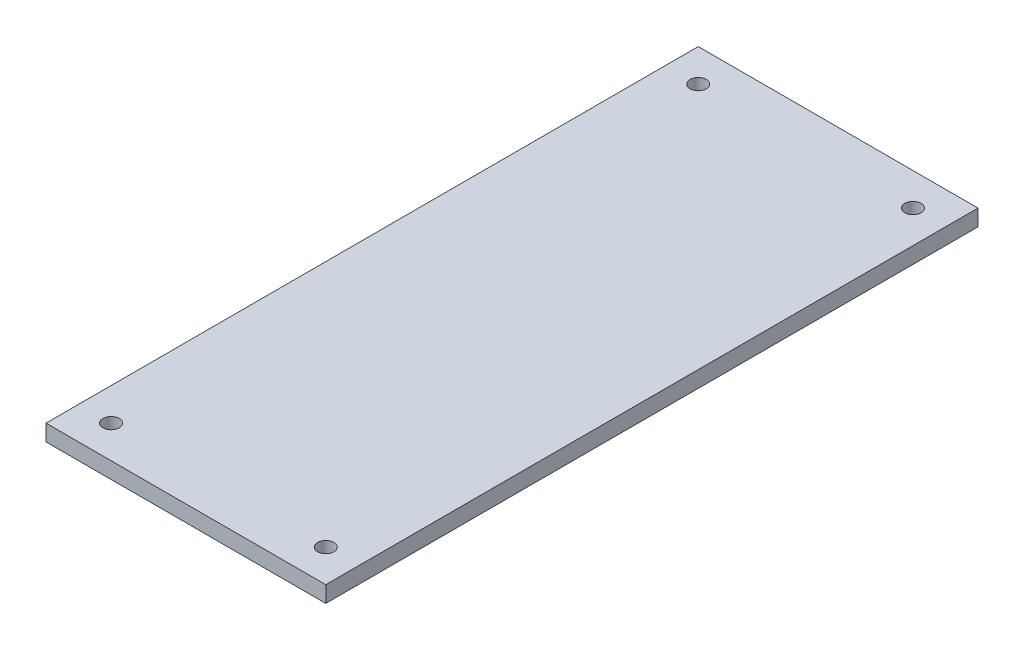
ISO-10303-21;
HEADER;
FILE_DESCRIPTION(('STEP AP214'),'2;1');
FILE_NAME('part.step','',(''),(''),'','','');
FILE_SCHEMA(('AUTOMOTIVE_DESIGN { 1 0 10303 214 1 1 1 1 }'));
ENDSEC;
DATA;
#1=APPLICATION_CONTEXT('core data for automotive mechanical design processes');
#2=APPLICATION_PROTOCOL_DEFINITION('international standard','automotive_design',2000,#1);
#3=PRODUCT_CONTEXT('',#1,'mechanical');
#4=PRODUCT('Part','Part','',(#3));
#5=PRODUCT_RELATED_PRODUCT_CATEGORY('part','',(#4));
#6=PRODUCT_DEFINITION_FORMATION('','',#4);
#7=PRODUCT_DEFINITION_CONTEXT('part definition',#1,'design');
#8=PRODUCT_DEFINITION('design','',#6,#7);
#9=PRODUCT_DEFINITION_SHAPE('','',#8);
#10=(LENGTH_UNIT() NAMED_UNIT(*) SI_UNIT(.MILLI.,.METRE.));
#11=(NAMED_UNIT(*) PLANE_ANGLE_UNIT() SI_UNIT($,.RADIAN.));
#12=(NAMED_UNIT(*) SI_UNIT($,.STERADIAN.) SOLID_ANGLE_UNIT());
#13=UNCERTAINTY_MEASURE_WITH_UNIT(LENGTH_MEASURE(1.E-05),#10,'distance_accuracy_value','');
#14=(GEOMETRIC_REPRESENTATION_CONTEXT(3) GLOBAL_UNCERTAINTY_ASSIGNED_CONTEXT((#13)) GLOBAL_UNIT_ASSIGNED_CONTEXT((#10,
#11,#12)) REPRESENTATION_CONTEXT('',''));
#15=CARTESIAN_POINT('',(0.,0.,0.));
#16=DIRECTION('',(0.,0.,1.));
#17=DIRECTION('',(1.,0.,0.));
#18=AXIS2_PLACEMENT_3D('',#15,#16,#17);
#19=CARTESIAN_POINT('',(43.,5.,-100.25));
#20=DIRECTION('',(-1.,0.,0.));
#21=DIRECTION('',(0.,0.,1.));
#22=AXIS2_PLACEMENT_3D('',#19,#20,#21);
#23=PLANE('',#22);
#24=DIRECTION('',(0.,0.,-1.));
#25=VECTOR('',#24,1.);
#26=CARTESIAN_POINT('',(43.,0.,-100.25));
#27=LINE('',#26,#25);
#28=CARTESIAN_POINT('',(43.,0.,100.25));
#29=VERTEX_POINT('',#28);
#30=CARTESIAN_POINT('',(43.,0.,-100.25));
#31=VERTEX_POINT('',#30);
#32=EDGE_CURVE('E96',#29,#31,#27,.T.);
#33=ORIENTED_EDGE('',*,*,#32,.T.);
#34=DIRECTION('',(0.,-1.,0.));
#35=VECTOR('',#34,1.);
#36=CARTESIAN_POINT('',(43.,5.,-100.25));
#37=LINE('',#36,#35);
#38=CARTESIAN_POINT('',(43.,5.,-100.25));
#39=VERTEX_POINT('',#38);
#40=EDGE_CURVE('E11',#39,#31,#37,.T.);
#41=ORIENTED_EDGE('',*,*,#40,.F.);
#42=DIRECTION('',(0.,0.,-1.));
#43=VECTOR('',#42,1.);
#44=CARTESIAN_POINT('',(43.,5.,-100.25));
#45=LINE('',#44,#43);
#46=CARTESIAN_POINT('',(43.,5.,100.25));
#47=VERTEX_POINT('',#46);
#48=EDGE_CURVE('E84',#47,#39,#45,.T.);
#49=ORIENTED_EDGE('',*,*,#48,.F.);
#50=DIRECTION('',(0.,-1.,0.));
#51=VECTOR('',#50,1.);
#52=CARTESIAN_POINT('',(43.,5.,100.25));
#53=LINE('',#52,#51);
#54=EDGE_CURVE('E92',#47,#29,#53,.T.);
#55=ORIENTED_EDGE('',*,*,#54,.T.);
#56=EDGE_LOOP('',(#33,#41,#49,#55));
#57=FACE_BOUND('',#56,.T.);
#58=ADVANCED_FACE('F33',(#57),#23,.F.);
#59=CARTESIAN_POINT('',(-43.,5.,-100.25));
#60=DIRECTION('',(0.,0.,1.));
#61=DIRECTION('',(1.,0.,0.));
#62=AXIS2_PLACEMENT_3D('',#59,#60,#61);
#63=PLANE('',#62);
#64=DIRECTION('',(-1.,0.,0.));
#65=VECTOR('',#64,1.);
#66=CARTESIAN_POINT('',(-43.,0.,-100.25));
#67=LINE('',#66,#65);
#68=CARTESIAN_POINT('',(-43.,0.,-100.25));
#69=VERTEX_POINT('',#68);
#70=EDGE_CURVE('E88',#31,#69,#67,.T.);
#71=ORIENTED_EDGE('',*,*,#70,.T.);
#72=DIRECTION('',(0.,-1.,0.));
#73=VECTOR('',#72,1.);
#74=CARTESIAN_POINT('',(-43.,5.,-100.25));
#75=LINE('',#74,#73);
#76=CARTESIAN_POINT('',(-43.,5.,-100.25));
#77=VERTEX_POINT('',#76);
#78=EDGE_CURVE('E41',#77,#69,#75,.T.);
#79=ORIENTED_EDGE('',*,*,#78,.F.);
#80=DIRECTION('',(-1.,0.,0.));
#81=VECTOR('',#80,1.);
#82=CARTESIAN_POINT('',(-43.,5.,-100.25));
#83=LINE('',#82,#81);
#84=EDGE_CURVE('E79',#39,#77,#83,.T.);
#85=ORIENTED_EDGE('',*,*,#84,.F.);
#86=ORIENTED_EDGE('',*,*,#40,.T.);
#87=EDGE_LOOP('',(#71,#79,#85,#86));
#88=FACE_BOUND('',#87,.T.);
#89=ADVANCED_FACE('F87',(#88),#63,.F.);
#90=CARTESIAN_POINT('',(-43.,5.,-100.25));
#91=DIRECTION('',(1.,0.,0.));
#92=DIRECTION('',(0.,0.,-1.));
#93=AXIS2_PLACEMENT_3D('',#90,#91,#92);
#94=PLANE('',#93);
#95=DIRECTION('',(0.,0.,1.));
#96=VECTOR('',#95,1.);
#97=CARTESIAN_POINT('',(-43.,0.,-100.25));
#98=LINE('',#97,#96);
#99=CARTESIAN_POINT('',(-43.,0.,100.25));
#100=VERTEX_POINT('',#99);
#101=EDGE_CURVE('E66',#69,#100,#98,.T.);
#102=ORIENTED_EDGE('',*,*,#101,.T.);
#103=DIRECTION('',(0.,-1.,0.));
#104=VECTOR('',#103,1.);
#105=CARTESIAN_POINT('',(-43.,5.,100.25));
#106=LINE('',#105,#104);
#107=CARTESIAN_POINT('',(-43.,5.,100.25));
#108=VERTEX_POINT('',#107);
#109=EDGE_CURVE('E89',#108,#100,#106,.T.);
#110=ORIENTED_EDGE('',*,*,#109,.F.);
#111=DIRECTION('',(0.,0.,1.));
#112=VECTOR('',#111,1.);
#113=CARTESIAN_POINT('',(-43.,5.,-100.25));
#114=LINE('',#113,#112);
#115=EDGE_CURVE('E82',#77,#108,#114,.T.);
#116=ORIENTED_EDGE('',*,*,#115,.F.);
#117=ORIENTED_EDGE('',*,*,#78,.T.);
#118=EDGE_LOOP('',(#102,#110,#116,#117));
#119=FACE_BOUND('',#118,.T.);
#120=ADVANCED_FACE('F90',(#119),#94,.F.);
#121=CARTESIAN_POINT('',(-43.,5.,100.25));
#122=DIRECTION('',(0.,0.,-1.));
#123=DIRECTION('',(-1.,0.,0.));
#124=AXIS2_PLACEMENT_3D('',#121,#122,#123);
#125=PLANE('',#124);
#126=DIRECTION('',(1.,0.,0.));
#127=VECTOR('',#126,1.);
#128=CARTESIAN_POINT('',(-43.,0.,100.25));
#129=LINE('',#128,#127);
#130=EDGE_CURVE('E72',#100,#29,#129,.T.);
#131=ORIENTED_EDGE('',*,*,#130,.T.);
#132=ORIENTED_EDGE('',*,*,#54,.F.);
#133=DIRECTION('',(1.,0.,0.));
#134=VECTOR('',#133,1.);
#135=CARTESIAN_POINT('',(-43.,5.,100.25));
#136=LINE('',#135,#134);
#137=EDGE_CURVE('E49',#108,#47,#136,.T.);
#138=ORIENTED_EDGE('',*,*,#137,.F.);
#139=ORIENTED_EDGE('',*,*,#109,.T.);
#140=EDGE_LOOP('',(#131,#132,#138,#139));
#141=FACE_BOUND('',#140,.T.);
#142=ADVANCED_FACE('F104',(#141),#125,.F.);
#143=CARTESIAN_POINT('',(0.,5.,0.));
#144=DIRECTION('',(0.,1.,0.));
#145=DIRECTION('',(0.,0.,1.));
#146=AXIS2_PLACEMENT_3D('',#143,#144,#145);
#147=PLANE('',#146);
#148=CARTESIAN_POINT('',(33.,5.,-90.25));
#149=DIRECTION('',(0.,1.,0.));
#150=DIRECTION('',(0.,0.,1.));
#151=AXIS2_PLACEMENT_3D('',#148,#149,#150);
#152=CIRCLE('',#151,2.5);
#153=CARTESIAN_POINT('',(33.,5.,-87.75));
#154=VERTEX_POINT('',#153);
#155=EDGE_CURVE('E123',#154,#154,#152,.T.);
#156=ORIENTED_EDGE('',*,*,#155,.F.);
#157=EDGE_LOOP('',(#156));
#158=FACE_BOUND('',#157,.T.);
#159=CARTESIAN_POINT('',(-33.,5.,90.25));
#160=DIRECTION('',(0.,1.,0.));
#161=DIRECTION('',(0.,0.,1.));
#162=AXIS2_PLACEMENT_3D('',#159,#160,#161);
#163=CIRCLE('',#162,2.5);
#164=CARTESIAN_POINT('',(-33.,5.,92.75));
#165=VERTEX_POINT('',#164);
#166=EDGE_CURVE('E116',#165,#165,#163,.T.);
#167=ORIENTED_EDGE('',*,*,#166,.F.);
#168=EDGE_LOOP('',(#167));
#169=FACE_BOUND('',#168,.T.);
#170=CARTESIAN_POINT('',(33.,5.,90.25));
#171=DIRECTION('',(0.,1.,0.));
#172=DIRECTION('',(0.,0.,1.));
#173=AXIS2_PLACEMENT_3D('',#170,#171,#172);
#174=CIRCLE('',#173,2.5);
#175=CARTESIAN_POINT('',(33.,5.,92.75));
#176=VERTEX_POINT('',#175);
#177=EDGE_CURVE('E128',#176,#176,#174,.T.);
#178=ORIENTED_EDGE('',*,*,#177,.F.);
#179=EDGE_LOOP('',(#178));
#180=FACE_BOUND('',#179,.T.);
#181=CARTESIAN_POINT('',(-33.,5.,-90.25));
#182=DIRECTION('',(0.,1.,0.));
#183=DIRECTION('',(0.,0.,1.));
#184=AXIS2_PLACEMENT_3D('',#181,#182,#183);
#185=CIRCLE('',#184,2.5);
#186=CARTESIAN_POINT('',(-33.,5.,-87.75));
#187=VERTEX_POINT('',#186);
#188=EDGE_CURVE('E110',#187,#187,#185,.T.);
#189=ORIENTED_EDGE('',*,*,#188,.F.);
#190=EDGE_LOOP('',(#189));
#191=FACE_BOUND('',#190,.T.);
#192=ORIENTED_EDGE('',*,*,#48,.T.);
#193=ORIENTED_EDGE('',*,*,#84,.T.);
#194=ORIENTED_EDGE('',*,*,#115,.T.);
#195=ORIENTED_EDGE('',*,*,#137,.T.);
#196=EDGE_LOOP('',(#192,#193,#194,#195));
#197=FACE_BOUND('',#196,.T.);
#198=ADVANCED_FACE('F80',(#158,#169,#180,#191,#197),#147,.T.);
#199=CARTESIAN_POINT('',(0.,0.,0.));
#200=DIRECTION('',(0.,1.,0.));
#201=DIRECTION('',(0.,0.,1.));
#202=AXIS2_PLACEMENT_3D('',#199,#200,#201);
#203=PLANE('',#202);
#204=CARTESIAN_POINT('',(33.,0.,-90.25));
#205=DIRECTION('',(0.,1.,0.));
#206=DIRECTION('',(0.,0.,1.));
#207=AXIS2_PLACEMENT_3D('',#204,#205,#206);
#208=CIRCLE('',#207,2.5);
#209=CARTESIAN_POINT('',(33.,0.,-87.75));
#210=VERTEX_POINT('',#209);
#211=EDGE_CURVE('E113',#210,#210,#208,.T.);
#212=ORIENTED_EDGE('',*,*,#211,.T.);
#213=EDGE_LOOP('',(#212));
#214=FACE_BOUND('',#213,.T.);
#215=CARTESIAN_POINT('',(-33.,0.,90.25));
#216=DIRECTION('',(0.,1.,0.));
#217=DIRECTION('',(0.,0.,1.));
#218=AXIS2_PLACEMENT_3D('',#215,#216,#217);
#219=CIRCLE('',#218,2.5);
#220=CARTESIAN_POINT('',(-33.,0.,92.75));
#221=VERTEX_POINT('',#220);
#222=EDGE_CURVE('E119',#221,#221,#219,.T.);
#223=ORIENTED_EDGE('',*,*,#222,.T.);
#224=EDGE_LOOP('',(#223));
#225=FACE_BOUND('',#224,.T.);
#226=CARTESIAN_POINT('',(33.,0.,90.25));
#227=DIRECTION('',(0.,1.,0.));
#228=DIRECTION('',(0.,0.,1.));
#229=AXIS2_PLACEMENT_3D('',#226,#227,#228);
#230=CIRCLE('',#229,2.5);
#231=CARTESIAN_POINT('',(33.,0.,92.75));
#232=VERTEX_POINT('',#231);
#233=EDGE_CURVE('E120',#232,#232,#230,.T.);
#234=ORIENTED_EDGE('',*,*,#233,.T.);
#235=EDGE_LOOP('',(#234));
#236=FACE_BOUND('',#235,.T.);
#237=CARTESIAN_POINT('',(-33.,0.,-90.25));
#238=DIRECTION('',(0.,1.,0.));
#239=DIRECTION('',(0.,0.,1.));
#240=AXIS2_PLACEMENT_3D('',#237,#238,#239);
#241=CIRCLE('',#240,2.5);
#242=CARTESIAN_POINT('',(-33.,0.,-87.75));
#243=VERTEX_POINT('',#242);
#244=EDGE_CURVE('E99',#243,#243,#241,.T.);
#245=ORIENTED_EDGE('',*,*,#244,.T.);
#246=EDGE_LOOP('',(#245));
#247=FACE_BOUND('',#246,.T.);
#248=ORIENTED_EDGE('',*,*,#32,.F.);
#249=ORIENTED_EDGE('',*,*,#130,.F.);
#250=ORIENTED_EDGE('',*,*,#101,.F.);
#251=ORIENTED_EDGE('',*,*,#70,.F.);
#252=EDGE_LOOP('',(#248,#249,#250,#251));
#253=FACE_BOUND('',#252,.T.);
#254=ADVANCED_FACE('F107',(#214,#225,#236,#247,#253),#203,.F.);
#255=CARTESIAN_POINT('',(-33.,0.,-90.25));
#256=DIRECTION('',(0.,1.,0.));
#257=DIRECTION('',(0.,0.,1.));
#258=AXIS2_PLACEMENT_3D('',#255,#256,#257);
#259=CYLINDRICAL_SURFACE('',#258,2.5);
#260=ORIENTED_EDGE('',*,*,#244,.F.);
#261=EDGE_LOOP('',(#260));
#262=FACE_BOUND('',#261,.T.);
#263=ORIENTED_EDGE('',*,*,#188,.T.);
#264=EDGE_LOOP('',(#263));
#265=FACE_BOUND('',#264,.T.);
#266=ADVANCED_FACE('F140',(#262,#265),#259,.F.);
#267=CARTESIAN_POINT('',(33.,0.,90.25));
#268=DIRECTION('',(0.,1.,0.));
#269=DIRECTION('',(0.,0.,1.));
#270=AXIS2_PLACEMENT_3D('',#267,#268,#269);
#271=CYLINDRICAL_SURFACE('',#270,2.5);
#272=ORIENTED_EDGE('',*,*,#233,.F.);
#273=EDGE_LOOP('',(#272));
#274=FACE_BOUND('',#273,.T.);
#275=ORIENTED_EDGE('',*,*,#177,.T.);
#276=EDGE_LOOP('',(#275));
#277=FACE_BOUND('',#276,.T.);
#278=ADVANCED_FACE('F136',(#274,#277),#271,.F.);
#279=CARTESIAN_POINT('',(-33.,0.,90.25));
#280=DIRECTION('',(0.,1.,0.));
#281=DIRECTION('',(0.,0.,1.));
#282=AXIS2_PLACEMENT_3D('',#279,#280,#281);
#283=CYLINDRICAL_SURFACE('',#282,2.5);
#284=ORIENTED_EDGE('',*,*,#222,.F.);
#285=EDGE_LOOP('',(#284));
#286=FACE_BOUND('',#285,.T.);
#287=ORIENTED_EDGE('',*,*,#166,.T.);
#288=EDGE_LOOP('',(#287));
#289=FACE_BOUND('',#288,.T.);
#290=ADVANCED_FACE('F139',(#286,#289),#283,.F.);
#291=CARTESIAN_POINT('',(33.,0.,-90.25));
#292=DIRECTION('',(0.,1.,0.));
#293=DIRECTION('',(0.,0.,1.));
#294=AXIS2_PLACEMENT_3D('',#291,#292,#293);
#295=CYLINDRICAL_SURFACE('',#294,2.5);
#296=ORIENTED_EDGE('',*,*,#211,.F.);
#297=EDGE_LOOP('',(#296));
#298=FACE_BOUND('',#297,.T.);
#299=ORIENTED_EDGE('',*,*,#155,.T.);
#300=EDGE_LOOP('',(#299));
#301=FACE_BOUND('',#300,.T.);
#302=ADVANCED_FACE('F201',(#298,#301),#295,.F.);
#303=CLOSED_SHELL('',(#58,#89,#120,#142,#198,#254,#266,#278,#290,#302));
#304=MANIFOLD_SOLID_BREP('B2',#303);
#305=ADVANCED_BREP_SHAPE_REPRESENTATION('',(#18,#304),#14);
#306=SHAPE_DEFINITION_REPRESENTATION(#9,#305);
ENDSEC;
END-ISO-10303-21;
